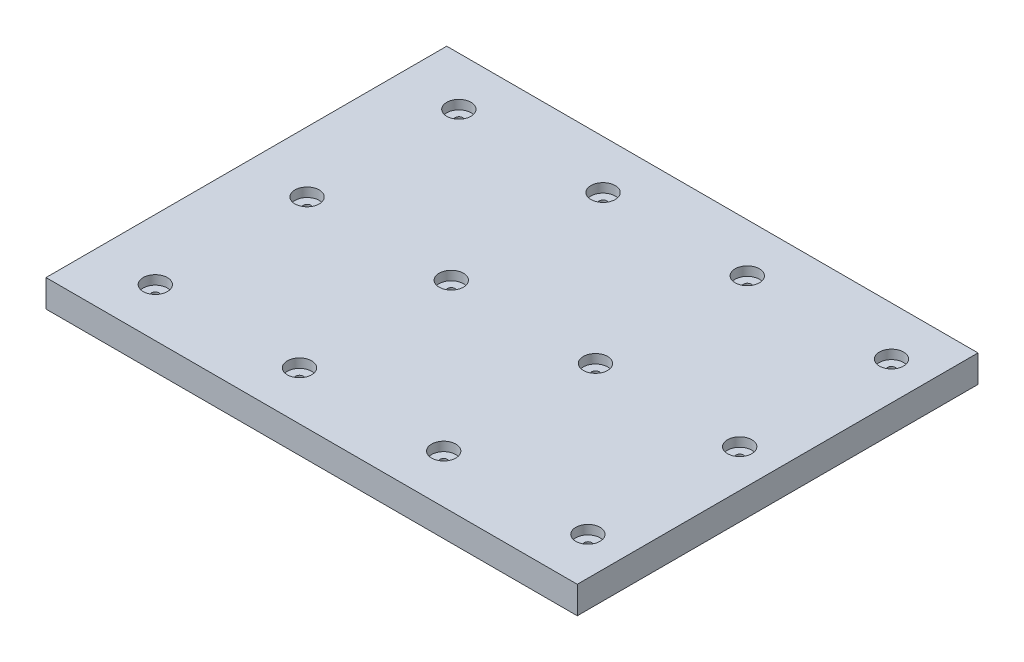
ISO-10303-21;
HEADER;
FILE_DESCRIPTION(('STEP AP214'),'2;1');
FILE_NAME('part.step','',(''),(''),'','','');
FILE_SCHEMA(('AUTOMOTIVE_DESIGN { 1 0 10303 214 1 1 1 1 }'));
ENDSEC;
DATA;
#1=APPLICATION_CONTEXT('core data for automotive mechanical design processes');
#2=APPLICATION_PROTOCOL_DEFINITION('international standard','automotive_design',2000,#1);
#3=PRODUCT_CONTEXT('',#1,'mechanical');
#4=PRODUCT('Part','Part','',(#3));
#5=PRODUCT_RELATED_PRODUCT_CATEGORY('part','',(#4));
#6=PRODUCT_DEFINITION_FORMATION('','',#4);
#7=PRODUCT_DEFINITION_CONTEXT('part definition',#1,'design');
#8=PRODUCT_DEFINITION('design','',#6,#7);
#9=PRODUCT_DEFINITION_SHAPE('','',#8);
#10=(LENGTH_UNIT() NAMED_UNIT(*) SI_UNIT(.MILLI.,.METRE.));
#11=(NAMED_UNIT(*) PLANE_ANGLE_UNIT() SI_UNIT($,.RADIAN.));
#12=(NAMED_UNIT(*) SI_UNIT($,.STERADIAN.) SOLID_ANGLE_UNIT());
#13=UNCERTAINTY_MEASURE_WITH_UNIT(LENGTH_MEASURE(1.E-05),#10,'distance_accuracy_value','');
#14=(GEOMETRIC_REPRESENTATION_CONTEXT(3) GLOBAL_UNCERTAINTY_ASSIGNED_CONTEXT((#13)) GLOBAL_UNIT_ASSIGNED_CONTEXT((#10,
#11,#12)) REPRESENTATION_CONTEXT('',''));
#15=CARTESIAN_POINT('',(0.,0.,0.));
#16=DIRECTION('',(0.,0.,1.));
#17=DIRECTION('',(1.,0.,0.));
#18=AXIS2_PLACEMENT_3D('',#15,#16,#17);
#19=CARTESIAN_POINT('',(40.,0.,-32.));
#20=DIRECTION('',(0.,1.,0.));
#21=DIRECTION('',(0.,0.,1.));
#22=AXIS2_PLACEMENT_3D('',#19,#20,#21);
#23=CYLINDRICAL_SURFACE('',#22,2.5);
#24=CARTESIAN_POINT('',(40.,0.,-32.));
#25=DIRECTION('',(0.,1.,0.));
#26=DIRECTION('',(0.,0.,1.));
#27=AXIS2_PLACEMENT_3D('',#24,#25,#26);
#28=CIRCLE('',#27,2.5);
#29=CARTESIAN_POINT('',(40.,0.,-29.5));
#30=VERTEX_POINT('',#29);
#31=EDGE_CURVE('E96',#30,#30,#28,.T.);
#32=ORIENTED_EDGE('',*,*,#31,.F.);
#33=EDGE_LOOP('',(#32));
#34=FACE_BOUND('',#33,.T.);
#35=CARTESIAN_POINT('',(40.,12.,-32.));
#36=DIRECTION('',(0.,1.,0.));
#37=DIRECTION('',(0.,0.,1.));
#38=AXIS2_PLACEMENT_3D('',#35,#36,#37);
#39=CIRCLE('',#38,2.5);
#40=CARTESIAN_POINT('',(40.,12.,-29.5));
#41=VERTEX_POINT('',#40);
#42=EDGE_CURVE('E139',#41,#41,#39,.F.);
#43=ORIENTED_EDGE('',*,*,#42,.F.);
#44=EDGE_LOOP('',(#43));
#45=FACE_BOUND('',#44,.T.);
#46=ADVANCED_FACE('F38',(#34,#45),#23,.F.);
#47=CARTESIAN_POINT('',(324.999999999999,0.,-232.));
#48=DIRECTION('',(0.,1.,0.));
#49=DIRECTION('',(0.,0.,1.));
#50=AXIS2_PLACEMENT_3D('',#47,#48,#49);
#51=CYLINDRICAL_SURFACE('',#50,2.50000000000002);
#52=CARTESIAN_POINT('',(324.999999999999,0.,-232.));
#53=DIRECTION('',(0.,1.,0.));
#54=DIRECTION('',(0.,0.,1.));
#55=AXIS2_PLACEMENT_3D('',#52,#53,#54);
#56=CIRCLE('',#55,2.50000000000002);
#57=CARTESIAN_POINT('',(324.999999999999,0.,-229.5));
#58=VERTEX_POINT('',#57);
#59=EDGE_CURVE('E150',#58,#58,#56,.T.);
#60=ORIENTED_EDGE('',*,*,#59,.F.);
#61=EDGE_LOOP('',(#60));
#62=FACE_BOUND('',#61,.T.);
#63=CARTESIAN_POINT('',(324.999999999999,12.,-232.));
#64=DIRECTION('',(0.,1.,0.));
#65=DIRECTION('',(0.,0.,1.));
#66=AXIS2_PLACEMENT_3D('',#63,#64,#65);
#67=CIRCLE('',#66,2.50000000000002);
#68=CARTESIAN_POINT('',(324.999999999999,12.,-229.5));
#69=VERTEX_POINT('',#68);
#70=EDGE_CURVE('E137',#69,#69,#67,.F.);
#71=ORIENTED_EDGE('',*,*,#70,.F.);
#72=EDGE_LOOP('',(#71));
#73=FACE_BOUND('',#72,.T.);
#74=ADVANCED_FACE('F281',(#62,#73),#51,.F.);
#75=CARTESIAN_POINT('',(229.999999999999,0.,-232.));
#76=DIRECTION('',(0.,1.,0.));
#77=DIRECTION('',(0.,0.,1.));
#78=AXIS2_PLACEMENT_3D('',#75,#76,#77);
#79=CYLINDRICAL_SURFACE('',#78,2.5);
#80=CARTESIAN_POINT('',(229.999999999999,0.,-232.));
#81=DIRECTION('',(0.,1.,0.));
#82=DIRECTION('',(0.,0.,1.));
#83=AXIS2_PLACEMENT_3D('',#80,#81,#82);
#84=CIRCLE('',#83,2.5);
#85=CARTESIAN_POINT('',(229.999999999999,0.,-229.5));
#86=VERTEX_POINT('',#85);
#87=EDGE_CURVE('E158',#86,#86,#84,.T.);
#88=ORIENTED_EDGE('',*,*,#87,.F.);
#89=EDGE_LOOP('',(#88));
#90=FACE_BOUND('',#89,.T.);
#91=CARTESIAN_POINT('',(229.999999999999,12.,-232.));
#92=DIRECTION('',(0.,1.,0.));
#93=DIRECTION('',(0.,0.,1.));
#94=AXIS2_PLACEMENT_3D('',#91,#92,#93);
#95=CIRCLE('',#94,2.5);
#96=CARTESIAN_POINT('',(229.999999999999,12.,-229.5));
#97=VERTEX_POINT('',#96);
#98=EDGE_CURVE('E134',#97,#97,#95,.F.);
#99=ORIENTED_EDGE('',*,*,#98,.F.);
#100=EDGE_LOOP('',(#99));
#101=FACE_BOUND('',#100,.T.);
#102=ADVANCED_FACE('F286',(#90,#101),#79,.F.);
#103=CARTESIAN_POINT('',(134.999999999999,0.,-232.));
#104=DIRECTION('',(0.,1.,0.));
#105=DIRECTION('',(0.,0.,1.));
#106=AXIS2_PLACEMENT_3D('',#103,#104,#105);
#107=CYLINDRICAL_SURFACE('',#106,2.50000000000002);
#108=CARTESIAN_POINT('',(134.999999999999,0.,-232.));
#109=DIRECTION('',(0.,1.,0.));
#110=DIRECTION('',(0.,0.,1.));
#111=AXIS2_PLACEMENT_3D('',#108,#109,#110);
#112=CIRCLE('',#111,2.50000000000002);
#113=CARTESIAN_POINT('',(134.999999999999,0.,-229.5));
#114=VERTEX_POINT('',#113);
#115=EDGE_CURVE('E159',#114,#114,#112,.T.);
#116=ORIENTED_EDGE('',*,*,#115,.F.);
#117=EDGE_LOOP('',(#116));
#118=FACE_BOUND('',#117,.T.);
#119=CARTESIAN_POINT('',(134.999999999999,12.,-232.));
#120=DIRECTION('',(0.,1.,0.));
#121=DIRECTION('',(0.,0.,1.));
#122=AXIS2_PLACEMENT_3D('',#119,#120,#121);
#123=CIRCLE('',#122,2.50000000000002);
#124=CARTESIAN_POINT('',(134.999999999999,12.,-229.5));
#125=VERTEX_POINT('',#124);
#126=EDGE_CURVE('E131',#125,#125,#123,.F.);
#127=ORIENTED_EDGE('',*,*,#126,.F.);
#128=EDGE_LOOP('',(#127));
#129=FACE_BOUND('',#128,.T.);
#130=ADVANCED_FACE('F319',(#118,#129),#107,.F.);
#131=CARTESIAN_POINT('',(39.9999999999993,0.,-232.));
#132=DIRECTION('',(0.,1.,0.));
#133=DIRECTION('',(0.,0.,1.));
#134=AXIS2_PLACEMENT_3D('',#131,#132,#133);
#135=CYLINDRICAL_SURFACE('',#134,2.5);
#136=CARTESIAN_POINT('',(39.9999999999993,0.,-232.));
#137=DIRECTION('',(0.,1.,0.));
#138=DIRECTION('',(0.,0.,1.));
#139=AXIS2_PLACEMENT_3D('',#136,#137,#138);
#140=CIRCLE('',#139,2.5);
#141=CARTESIAN_POINT('',(39.9999999999993,0.,-229.5));
#142=VERTEX_POINT('',#141);
#143=EDGE_CURVE('E141',#142,#142,#140,.T.);
#144=ORIENTED_EDGE('',*,*,#143,.F.);
#145=EDGE_LOOP('',(#144));
#146=FACE_BOUND('',#145,.T.);
#147=CARTESIAN_POINT('',(39.9999999999993,12.,-232.));
#148=DIRECTION('',(0.,1.,0.));
#149=DIRECTION('',(0.,0.,1.));
#150=AXIS2_PLACEMENT_3D('',#147,#148,#149);
#151=CIRCLE('',#150,2.5);
#152=CARTESIAN_POINT('',(39.9999999999993,12.,-229.5));
#153=VERTEX_POINT('',#152);
#154=EDGE_CURVE('E128',#153,#153,#151,.F.);
#155=ORIENTED_EDGE('',*,*,#154,.F.);
#156=EDGE_LOOP('',(#155));
#157=FACE_BOUND('',#156,.T.);
#158=ADVANCED_FACE('F322',(#146,#157),#135,.F.);
#159=CARTESIAN_POINT('',(39.9999999999997,0.,-132.));
#160=DIRECTION('',(0.,1.,0.));
#161=DIRECTION('',(0.,0.,1.));
#162=AXIS2_PLACEMENT_3D('',#159,#160,#161);
#163=CYLINDRICAL_SURFACE('',#162,2.5);
#164=CARTESIAN_POINT('',(39.9999999999997,0.,-132.));
#165=DIRECTION('',(0.,1.,0.));
#166=DIRECTION('',(0.,0.,1.));
#167=AXIS2_PLACEMENT_3D('',#164,#165,#166);
#168=CIRCLE('',#167,2.5);
#169=CARTESIAN_POINT('',(39.9999999999997,0.,-129.5));
#170=VERTEX_POINT('',#169);
#171=EDGE_CURVE('E145',#170,#170,#168,.T.);
#172=ORIENTED_EDGE('',*,*,#171,.F.);
#173=EDGE_LOOP('',(#172));
#174=FACE_BOUND('',#173,.T.);
#175=CARTESIAN_POINT('',(39.9999999999997,12.,-132.));
#176=DIRECTION('',(0.,1.,0.));
#177=DIRECTION('',(0.,0.,1.));
#178=AXIS2_PLACEMENT_3D('',#175,#176,#177);
#179=CIRCLE('',#178,2.5);
#180=CARTESIAN_POINT('',(39.9999999999997,12.,-129.5));
#181=VERTEX_POINT('',#180);
#182=EDGE_CURVE('E125',#181,#181,#179,.F.);
#183=ORIENTED_EDGE('',*,*,#182,.F.);
#184=EDGE_LOOP('',(#183));
#185=FACE_BOUND('',#184,.T.);
#186=ADVANCED_FACE('F304',(#174,#185),#163,.F.);
#187=CARTESIAN_POINT('',(135.,0.,-32.));
#188=DIRECTION('',(0.,1.,0.));
#189=DIRECTION('',(0.,0.,1.));
#190=AXIS2_PLACEMENT_3D('',#187,#188,#189);
#191=CYLINDRICAL_SURFACE('',#190,2.5);
#192=CARTESIAN_POINT('',(135.,0.,-32.));
#193=DIRECTION('',(0.,1.,0.));
#194=DIRECTION('',(0.,0.,1.));
#195=AXIS2_PLACEMENT_3D('',#192,#193,#194);
#196=CIRCLE('',#195,2.5);
#197=CARTESIAN_POINT('',(135.,0.,-29.5));
#198=VERTEX_POINT('',#197);
#199=EDGE_CURVE('E100',#198,#198,#196,.T.);
#200=ORIENTED_EDGE('',*,*,#199,.F.);
#201=EDGE_LOOP('',(#200));
#202=FACE_BOUND('',#201,.T.);
#203=CARTESIAN_POINT('',(135.,12.,-32.));
#204=DIRECTION('',(0.,1.,0.));
#205=DIRECTION('',(0.,0.,1.));
#206=AXIS2_PLACEMENT_3D('',#203,#204,#205);
#207=CIRCLE('',#206,2.5);
#208=CARTESIAN_POINT('',(135.,12.,-29.5));
#209=VERTEX_POINT('',#208);
#210=EDGE_CURVE('E122',#209,#209,#207,.F.);
#211=ORIENTED_EDGE('',*,*,#210,.F.);
#212=EDGE_LOOP('',(#211));
#213=FACE_BOUND('',#212,.T.);
#214=ADVANCED_FACE('F300',(#202,#213),#191,.F.);
#215=CARTESIAN_POINT('',(230.,0.,-32.));
#216=DIRECTION('',(0.,1.,0.));
#217=DIRECTION('',(0.,0.,1.));
#218=AXIS2_PLACEMENT_3D('',#215,#216,#217);
#219=CYLINDRICAL_SURFACE('',#218,2.5);
#220=CARTESIAN_POINT('',(230.,0.,-32.));
#221=DIRECTION('',(0.,1.,0.));
#222=DIRECTION('',(0.,0.,1.));
#223=AXIS2_PLACEMENT_3D('',#220,#221,#222);
#224=CIRCLE('',#223,2.5);
#225=CARTESIAN_POINT('',(230.,0.,-29.5));
#226=VERTEX_POINT('',#225);
#227=EDGE_CURVE('E176',#226,#226,#224,.T.);
#228=ORIENTED_EDGE('',*,*,#227,.F.);
#229=EDGE_LOOP('',(#228));
#230=FACE_BOUND('',#229,.T.);
#231=CARTESIAN_POINT('',(230.,12.,-32.));
#232=DIRECTION('',(0.,1.,0.));
#233=DIRECTION('',(0.,0.,1.));
#234=AXIS2_PLACEMENT_3D('',#231,#232,#233);
#235=CIRCLE('',#234,2.5);
#236=CARTESIAN_POINT('',(230.,12.,-29.5));
#237=VERTEX_POINT('',#236);
#238=EDGE_CURVE('E119',#237,#237,#235,.F.);
#239=ORIENTED_EDGE('',*,*,#238,.F.);
#240=EDGE_LOOP('',(#239));
#241=FACE_BOUND('',#240,.T.);
#242=ADVANCED_FACE('F296',(#230,#241),#219,.F.);
#243=CARTESIAN_POINT('',(325.,0.,-32.));
#244=DIRECTION('',(0.,1.,0.));
#245=DIRECTION('',(0.,0.,1.));
#246=AXIS2_PLACEMENT_3D('',#243,#244,#245);
#247=CYLINDRICAL_SURFACE('',#246,2.50000000000002);
#248=CARTESIAN_POINT('',(325.,0.,-32.));
#249=DIRECTION('',(0.,1.,0.));
#250=DIRECTION('',(0.,0.,1.));
#251=AXIS2_PLACEMENT_3D('',#248,#249,#250);
#252=CIRCLE('',#251,2.50000000000002);
#253=CARTESIAN_POINT('',(325.,0.,-29.5));
#254=VERTEX_POINT('',#253);
#255=EDGE_CURVE('E173',#254,#254,#252,.T.);
#256=ORIENTED_EDGE('',*,*,#255,.F.);
#257=EDGE_LOOP('',(#256));
#258=FACE_BOUND('',#257,.T.);
#259=CARTESIAN_POINT('',(325.,12.,-32.));
#260=DIRECTION('',(0.,1.,0.));
#261=DIRECTION('',(0.,0.,1.));
#262=AXIS2_PLACEMENT_3D('',#259,#260,#261);
#263=CIRCLE('',#262,2.50000000000002);
#264=CARTESIAN_POINT('',(325.,12.,-29.5));
#265=VERTEX_POINT('',#264);
#266=EDGE_CURVE('E116',#265,#265,#263,.F.);
#267=ORIENTED_EDGE('',*,*,#266,.F.);
#268=EDGE_LOOP('',(#267));
#269=FACE_BOUND('',#268,.T.);
#270=ADVANCED_FACE('F292',(#258,#269),#247,.F.);
#271=CARTESIAN_POINT('',(135.,0.,-132.));
#272=DIRECTION('',(0.,1.,0.));
#273=DIRECTION('',(0.,0.,1.));
#274=AXIS2_PLACEMENT_3D('',#271,#272,#273);
#275=CYLINDRICAL_SURFACE('',#274,2.50000000000002);
#276=CARTESIAN_POINT('',(135.,0.,-132.));
#277=DIRECTION('',(0.,1.,0.));
#278=DIRECTION('',(0.,0.,1.));
#279=AXIS2_PLACEMENT_3D('',#276,#277,#278);
#280=CIRCLE('',#279,2.50000000000002);
#281=CARTESIAN_POINT('',(135.,0.,-129.5));
#282=VERTEX_POINT('',#281);
#283=EDGE_CURVE('E168',#282,#282,#280,.T.);
#284=ORIENTED_EDGE('',*,*,#283,.F.);
#285=EDGE_LOOP('',(#284));
#286=FACE_BOUND('',#285,.T.);
#287=CARTESIAN_POINT('',(135.,12.,-132.));
#288=DIRECTION('',(0.,1.,0.));
#289=DIRECTION('',(0.,0.,1.));
#290=AXIS2_PLACEMENT_3D('',#287,#288,#289);
#291=CIRCLE('',#290,2.50000000000002);
#292=CARTESIAN_POINT('',(135.,12.,-129.5));
#293=VERTEX_POINT('',#292);
#294=EDGE_CURVE('E113',#293,#293,#291,.F.);
#295=ORIENTED_EDGE('',*,*,#294,.F.);
#296=EDGE_LOOP('',(#295));
#297=FACE_BOUND('',#296,.T.);
#298=ADVANCED_FACE('F295',(#286,#297),#275,.F.);
#299=CARTESIAN_POINT('',(230.,0.,-132.));
#300=DIRECTION('',(0.,1.,0.));
#301=DIRECTION('',(0.,0.,1.));
#302=AXIS2_PLACEMENT_3D('',#299,#300,#301);
#303=CYLINDRICAL_SURFACE('',#302,2.5);
#304=CARTESIAN_POINT('',(230.,0.,-132.));
#305=DIRECTION('',(0.,1.,0.));
#306=DIRECTION('',(0.,0.,1.));
#307=AXIS2_PLACEMENT_3D('',#304,#305,#306);
#308=CIRCLE('',#307,2.5);
#309=CARTESIAN_POINT('',(230.,0.,-129.5));
#310=VERTEX_POINT('',#309);
#311=EDGE_CURVE('E165',#310,#310,#308,.T.);
#312=ORIENTED_EDGE('',*,*,#311,.F.);
#313=EDGE_LOOP('',(#312));
#314=FACE_BOUND('',#313,.T.);
#315=CARTESIAN_POINT('',(230.,12.,-132.));
#316=DIRECTION('',(0.,1.,0.));
#317=DIRECTION('',(0.,0.,1.));
#318=AXIS2_PLACEMENT_3D('',#315,#316,#317);
#319=CIRCLE('',#318,2.5);
#320=CARTESIAN_POINT('',(230.,12.,-129.5));
#321=VERTEX_POINT('',#320);
#322=EDGE_CURVE('E109',#321,#321,#319,.F.);
#323=ORIENTED_EDGE('',*,*,#322,.F.);
#324=EDGE_LOOP('',(#323));
#325=FACE_BOUND('',#324,.T.);
#326=ADVANCED_FACE('F308',(#314,#325),#303,.F.);
#327=CARTESIAN_POINT('',(325.,0.,-132.));
#328=DIRECTION('',(0.,1.,0.));
#329=DIRECTION('',(0.,0.,1.));
#330=AXIS2_PLACEMENT_3D('',#327,#328,#329);
#331=CYLINDRICAL_SURFACE('',#330,2.50000000000002);
#332=CARTESIAN_POINT('',(325.,0.,-132.));
#333=DIRECTION('',(0.,1.,0.));
#334=DIRECTION('',(0.,0.,1.));
#335=AXIS2_PLACEMENT_3D('',#332,#333,#334);
#336=CIRCLE('',#335,2.50000000000002);
#337=CARTESIAN_POINT('',(325.,0.,-129.5));
#338=VERTEX_POINT('',#337);
#339=EDGE_CURVE('E162',#338,#338,#336,.T.);
#340=ORIENTED_EDGE('',*,*,#339,.F.);
#341=EDGE_LOOP('',(#340));
#342=FACE_BOUND('',#341,.T.);
#343=CARTESIAN_POINT('',(325.,12.,-132.));
#344=DIRECTION('',(0.,1.,0.));
#345=DIRECTION('',(0.,0.,1.));
#346=AXIS2_PLACEMENT_3D('',#343,#344,#345);
#347=CIRCLE('',#346,2.50000000000002);
#348=CARTESIAN_POINT('',(325.,12.,-129.5));
#349=VERTEX_POINT('',#348);
#350=EDGE_CURVE('E106',#349,#349,#347,.F.);
#351=ORIENTED_EDGE('',*,*,#350,.F.);
#352=EDGE_LOOP('',(#351));
#353=FACE_BOUND('',#352,.T.);
#354=ADVANCED_FACE('F310',(#342,#353),#331,.F.);
#355=CARTESIAN_POINT('',(0.,18.,0.));
#356=DIRECTION('',(1.,0.,0.));
#357=DIRECTION('',(0.,0.,-1.));
#358=AXIS2_PLACEMENT_3D('',#355,#356,#357);
#359=PLANE('',#358);
#360=DIRECTION('',(0.,0.,1.));
#361=VECTOR('',#360,1.);
#362=CARTESIAN_POINT('',(0.,0.,0.));
#363=LINE('',#362,#361);
#364=CARTESIAN_POINT('',(0.,0.,-264.));
#365=VERTEX_POINT('',#364);
#366=CARTESIAN_POINT('',(0.,0.,0.));
#367=VERTEX_POINT('',#366);
#368=EDGE_CURVE('E90',#365,#367,#363,.T.);
#369=ORIENTED_EDGE('',*,*,#368,.T.);
#370=DIRECTION('',(0.,-1.,0.));
#371=VECTOR('',#370,1.);
#372=CARTESIAN_POINT('',(0.,18.,0.));
#373=LINE('',#372,#371);
#374=CARTESIAN_POINT('',(0.,18.,0.));
#375=VERTEX_POINT('',#374);
#376=EDGE_CURVE('E46',#375,#367,#373,.T.);
#377=ORIENTED_EDGE('',*,*,#376,.F.);
#378=DIRECTION('',(0.,0.,1.));
#379=VECTOR('',#378,1.);
#380=CARTESIAN_POINT('',(0.,18.,0.));
#381=LINE('',#380,#379);
#382=CARTESIAN_POINT('',(0.,18.,-264.));
#383=VERTEX_POINT('',#382);
#384=EDGE_CURVE('E84',#383,#375,#381,.T.);
#385=ORIENTED_EDGE('',*,*,#384,.F.);
#386=DIRECTION('',(0.,-1.,0.));
#387=VECTOR('',#386,1.);
#388=CARTESIAN_POINT('',(0.,18.,-264.));
#389=LINE('',#388,#387);
#390=EDGE_CURVE('E78',#383,#365,#389,.T.);
#391=ORIENTED_EDGE('',*,*,#390,.T.);
#392=EDGE_LOOP('',(#369,#377,#385,#391));
#393=FACE_BOUND('',#392,.T.);
#394=ADVANCED_FACE('F40',(#393),#359,.F.);
#395=CARTESIAN_POINT('',(0.,18.,0.));
#396=DIRECTION('',(0.,0.,-1.));
#397=DIRECTION('',(-1.,0.,0.));
#398=AXIS2_PLACEMENT_3D('',#395,#396,#397);
#399=PLANE('',#398);
#400=DIRECTION('',(1.,0.,0.));
#401=VECTOR('',#400,1.);
#402=CARTESIAN_POINT('',(0.,0.,0.));
#403=LINE('',#402,#401);
#404=CARTESIAN_POINT('',(350.,0.,0.));
#405=VERTEX_POINT('',#404);
#406=EDGE_CURVE('E85',#367,#405,#403,.T.);
#407=ORIENTED_EDGE('',*,*,#406,.T.);
#408=DIRECTION('',(0.,1.,0.));
#409=VECTOR('',#408,1.);
#410=CARTESIAN_POINT('',(350.,-2.,0.));
#411=LINE('',#410,#409);
#412=CARTESIAN_POINT('',(350.,18.,0.));
#413=VERTEX_POINT('',#412);
#414=EDGE_CURVE('E52',#405,#413,#411,.T.);
#415=ORIENTED_EDGE('',*,*,#414,.T.);
#416=DIRECTION('',(1.,0.,0.));
#417=VECTOR('',#416,1.);
#418=CARTESIAN_POINT('',(0.,18.,0.));
#419=LINE('',#418,#417);
#420=EDGE_CURVE('E181',#375,#413,#419,.T.);
#421=ORIENTED_EDGE('',*,*,#420,.F.);
#422=ORIENTED_EDGE('',*,*,#376,.T.);
#423=EDGE_LOOP('',(#407,#415,#421,#422));
#424=FACE_BOUND('',#423,.T.);
#425=ADVANCED_FACE('F189',(#424),#399,.F.);
#426=CARTESIAN_POINT('',(0.,18.,-264.));
#427=DIRECTION('',(0.,0.,1.));
#428=DIRECTION('',(1.,0.,0.));
#429=AXIS2_PLACEMENT_3D('',#426,#427,#428);
#430=PLANE('',#429);
#431=DIRECTION('',(-1.,0.,0.));
#432=VECTOR('',#431,1.);
#433=CARTESIAN_POINT('',(0.,18.,-264.));
#434=LINE('',#433,#432);
#435=CARTESIAN_POINT('',(350.,18.,-264.));
#436=VERTEX_POINT('',#435);
#437=EDGE_CURVE('E61',#436,#383,#434,.T.);
#438=ORIENTED_EDGE('',*,*,#437,.F.);
#439=DIRECTION('',(0.,1.,0.));
#440=VECTOR('',#439,1.);
#441=CARTESIAN_POINT('',(350.,-2.,-264.));
#442=LINE('',#441,#440);
#443=CARTESIAN_POINT('',(350.,0.,-264.));
#444=VERTEX_POINT('',#443);
#445=EDGE_CURVE('E81',#444,#436,#442,.T.);
#446=ORIENTED_EDGE('',*,*,#445,.F.);
#447=DIRECTION('',(-1.,0.,0.));
#448=VECTOR('',#447,1.);
#449=CARTESIAN_POINT('',(0.,0.,-264.));
#450=LINE('',#449,#448);
#451=EDGE_CURVE('E75',#444,#365,#450,.T.);
#452=ORIENTED_EDGE('',*,*,#451,.T.);
#453=ORIENTED_EDGE('',*,*,#390,.F.);
#454=EDGE_LOOP('',(#438,#446,#452,#453));
#455=FACE_BOUND('',#454,.T.);
#456=ADVANCED_FACE('F77',(#455),#430,.F.);
#457=CARTESIAN_POINT('',(0.,18.,0.));
#458=DIRECTION('',(0.,-1.,0.));
#459=DIRECTION('',(0.,0.,-1.));
#460=AXIS2_PLACEMENT_3D('',#457,#458,#459);
#461=PLANE('',#460);
#462=CARTESIAN_POINT('',(325.,18.,-132.));
#463=DIRECTION('',(0.,1.,0.));
#464=DIRECTION('',(0.,0.,1.));
#465=AXIS2_PLACEMENT_3D('',#462,#463,#464);
#466=CIRCLE('',#465,7.99999999999999);
#467=CARTESIAN_POINT('',(325.,18.,-124.));
#468=VERTEX_POINT('',#467);
#469=EDGE_CURVE('E216',#468,#468,#466,.T.);
#470=ORIENTED_EDGE('',*,*,#469,.F.);
#471=EDGE_LOOP('',(#470));
#472=FACE_BOUND('',#471,.T.);
#473=CARTESIAN_POINT('',(230.,18.,-132.));
#474=DIRECTION('',(0.,1.,0.));
#475=DIRECTION('',(0.,0.,1.));
#476=AXIS2_PLACEMENT_3D('',#473,#474,#475);
#477=CIRCLE('',#476,7.99999999999999);
#478=CARTESIAN_POINT('',(230.,18.,-124.));
#479=VERTEX_POINT('',#478);
#480=EDGE_CURVE('E229',#479,#479,#477,.T.);
#481=ORIENTED_EDGE('',*,*,#480,.F.);
#482=EDGE_LOOP('',(#481));
#483=FACE_BOUND('',#482,.T.);
#484=CARTESIAN_POINT('',(135.,18.,-132.));
#485=DIRECTION('',(0.,1.,0.));
#486=DIRECTION('',(0.,0.,1.));
#487=AXIS2_PLACEMENT_3D('',#484,#485,#486);
#488=CIRCLE('',#487,8.00000000000001);
#489=CARTESIAN_POINT('',(135.,18.,-124.));
#490=VERTEX_POINT('',#489);
#491=EDGE_CURVE('E228',#490,#490,#488,.T.);
#492=ORIENTED_EDGE('',*,*,#491,.F.);
#493=EDGE_LOOP('',(#492));
#494=FACE_BOUND('',#493,.T.);
#495=CARTESIAN_POINT('',(325.,18.,-32.));
#496=DIRECTION('',(0.,1.,0.));
#497=DIRECTION('',(0.,0.,1.));
#498=AXIS2_PLACEMENT_3D('',#495,#496,#497);
#499=CIRCLE('',#498,7.99999999999998);
#500=CARTESIAN_POINT('',(325.,18.,-24.));
#501=VERTEX_POINT('',#500);
#502=EDGE_CURVE('E240',#501,#501,#499,.T.);
#503=ORIENTED_EDGE('',*,*,#502,.F.);
#504=EDGE_LOOP('',(#503));
#505=FACE_BOUND('',#504,.T.);
#506=CARTESIAN_POINT('',(230.,18.,-32.));
#507=DIRECTION('',(0.,1.,0.));
#508=DIRECTION('',(0.,0.,1.));
#509=AXIS2_PLACEMENT_3D('',#506,#507,#508);
#510=CIRCLE('',#509,7.99999999999998);
#511=CARTESIAN_POINT('',(230.,18.,-24.));
#512=VERTEX_POINT('',#511);
#513=EDGE_CURVE('E252',#512,#512,#510,.T.);
#514=ORIENTED_EDGE('',*,*,#513,.F.);
#515=EDGE_LOOP('',(#514));
#516=FACE_BOUND('',#515,.T.);
#517=CARTESIAN_POINT('',(135.,18.,-32.));
#518=DIRECTION('',(0.,1.,0.));
#519=DIRECTION('',(0.,0.,1.));
#520=AXIS2_PLACEMENT_3D('',#517,#518,#519);
#521=CIRCLE('',#520,7.99999999999998);
#522=CARTESIAN_POINT('',(135.,18.,-24.));
#523=VERTEX_POINT('',#522);
#524=EDGE_CURVE('E246',#523,#523,#521,.T.);
#525=ORIENTED_EDGE('',*,*,#524,.F.);
#526=EDGE_LOOP('',(#525));
#527=FACE_BOUND('',#526,.T.);
#528=CARTESIAN_POINT('',(39.9999999999997,18.,-132.));
#529=DIRECTION('',(0.,1.,0.));
#530=DIRECTION('',(0.,0.,1.));
#531=AXIS2_PLACEMENT_3D('',#528,#529,#530);
#532=CIRCLE('',#531,8.);
#533=CARTESIAN_POINT('',(39.9999999999997,18.,-124.));
#534=VERTEX_POINT('',#533);
#535=EDGE_CURVE('E199',#534,#534,#532,.T.);
#536=ORIENTED_EDGE('',*,*,#535,.F.);
#537=EDGE_LOOP('',(#536));
#538=FACE_BOUND('',#537,.T.);
#539=CARTESIAN_POINT('',(39.9999999999993,18.,-232.));
#540=DIRECTION('',(0.,1.,0.));
#541=DIRECTION('',(0.,0.,1.));
#542=AXIS2_PLACEMENT_3D('',#539,#540,#541);
#543=CIRCLE('',#542,8.);
#544=CARTESIAN_POINT('',(39.9999999999993,18.,-224.));
#545=VERTEX_POINT('',#544);
#546=EDGE_CURVE('E190',#545,#545,#543,.T.);
#547=ORIENTED_EDGE('',*,*,#546,.F.);
#548=EDGE_LOOP('',(#547));
#549=FACE_BOUND('',#548,.T.);
#550=CARTESIAN_POINT('',(134.999999999999,18.,-232.));
#551=DIRECTION('',(0.,1.,0.));
#552=DIRECTION('',(0.,0.,1.));
#553=AXIS2_PLACEMENT_3D('',#550,#551,#552);
#554=CIRCLE('',#553,8.00000000000001);
#555=CARTESIAN_POINT('',(134.999999999999,18.,-224.));
#556=VERTEX_POINT('',#555);
#557=EDGE_CURVE('E217',#556,#556,#554,.T.);
#558=ORIENTED_EDGE('',*,*,#557,.F.);
#559=EDGE_LOOP('',(#558));
#560=FACE_BOUND('',#559,.T.);
#561=CARTESIAN_POINT('',(229.999999999999,18.,-232.));
#562=DIRECTION('',(0.,1.,0.));
#563=DIRECTION('',(0.,0.,1.));
#564=AXIS2_PLACEMENT_3D('',#561,#562,#563);
#565=CIRCLE('',#564,7.99999999999999);
#566=CARTESIAN_POINT('',(229.999999999999,18.,-224.));
#567=VERTEX_POINT('',#566);
#568=EDGE_CURVE('E210',#567,#567,#565,.T.);
#569=ORIENTED_EDGE('',*,*,#568,.F.);
#570=EDGE_LOOP('',(#569));
#571=FACE_BOUND('',#570,.T.);
#572=CARTESIAN_POINT('',(324.999999999999,18.,-232.));
#573=DIRECTION('',(0.,1.,0.));
#574=DIRECTION('',(0.,0.,1.));
#575=AXIS2_PLACEMENT_3D('',#572,#573,#574);
#576=CIRCLE('',#575,7.99999999999999);
#577=CARTESIAN_POINT('',(324.999999999999,18.,-224.));
#578=VERTEX_POINT('',#577);
#579=EDGE_CURVE('E204',#578,#578,#576,.T.);
#580=ORIENTED_EDGE('',*,*,#579,.F.);
#581=EDGE_LOOP('',(#580));
#582=FACE_BOUND('',#581,.T.);
#583=CARTESIAN_POINT('',(40.,18.,-32.));
#584=DIRECTION('',(0.,1.,0.));
#585=DIRECTION('',(0.,0.,1.));
#586=AXIS2_PLACEMENT_3D('',#583,#584,#585);
#587=CIRCLE('',#586,8.);
#588=CARTESIAN_POINT('',(40.,18.,-24.));
#589=VERTEX_POINT('',#588);
#590=EDGE_CURVE('E153',#589,#589,#587,.T.);
#591=ORIENTED_EDGE('',*,*,#590,.F.);
#592=EDGE_LOOP('',(#591));
#593=FACE_BOUND('',#592,.T.);
#594=ORIENTED_EDGE('',*,*,#420,.T.);
#595=DIRECTION('',(0.,0.,1.));
#596=VECTOR('',#595,1.);
#597=CARTESIAN_POINT('',(350.,18.,-264.));
#598=LINE('',#597,#596);
#599=EDGE_CURVE('E186',#436,#413,#598,.T.);
#600=ORIENTED_EDGE('',*,*,#599,.F.);
#601=ORIENTED_EDGE('',*,*,#437,.T.);
#602=ORIENTED_EDGE('',*,*,#384,.T.);
#603=EDGE_LOOP('',(#594,#600,#601,#602));
#604=FACE_BOUND('',#603,.T.);
#605=ADVANCED_FACE('F184',(#472,#483,#494,#505,#516,#527,#538,#549,#560,#571,#582,#593,#604),
#461,.F.);
#606=CARTESIAN_POINT('',(0.,0.,0.));
#607=DIRECTION('',(0.,-1.,0.));
#608=DIRECTION('',(0.,0.,-1.));
#609=AXIS2_PLACEMENT_3D('',#606,#607,#608);
#610=PLANE('',#609);
#611=DIRECTION('',(0.,0.,-1.));
#612=VECTOR('',#611,1.);
#613=CARTESIAN_POINT('',(350.,0.,0.));
#614=LINE('',#613,#612);
#615=EDGE_CURVE('E11',#405,#444,#614,.T.);
#616=ORIENTED_EDGE('',*,*,#615,.F.);
#617=ORIENTED_EDGE('',*,*,#406,.F.);
#618=ORIENTED_EDGE('',*,*,#368,.F.);
#619=ORIENTED_EDGE('',*,*,#451,.F.);
#620=EDGE_LOOP('',(#616,#617,#618,#619));
#621=FACE_BOUND('',#620,.T.);
#622=ORIENTED_EDGE('',*,*,#339,.T.);
#623=EDGE_LOOP('',(#622));
#624=FACE_BOUND('',#623,.T.);
#625=ORIENTED_EDGE('',*,*,#311,.T.);
#626=EDGE_LOOP('',(#625));
#627=FACE_BOUND('',#626,.T.);
#628=ORIENTED_EDGE('',*,*,#283,.T.);
#629=EDGE_LOOP('',(#628));
#630=FACE_BOUND('',#629,.T.);
#631=ORIENTED_EDGE('',*,*,#255,.T.);
#632=EDGE_LOOP('',(#631));
#633=FACE_BOUND('',#632,.T.);
#634=ORIENTED_EDGE('',*,*,#227,.T.);
#635=EDGE_LOOP('',(#634));
#636=FACE_BOUND('',#635,.T.);
#637=ORIENTED_EDGE('',*,*,#199,.T.);
#638=EDGE_LOOP('',(#637));
#639=FACE_BOUND('',#638,.T.);
#640=ORIENTED_EDGE('',*,*,#171,.T.);
#641=EDGE_LOOP('',(#640));
#642=FACE_BOUND('',#641,.T.);
#643=ORIENTED_EDGE('',*,*,#143,.T.);
#644=EDGE_LOOP('',(#643));
#645=FACE_BOUND('',#644,.T.);
#646=ORIENTED_EDGE('',*,*,#115,.T.);
#647=EDGE_LOOP('',(#646));
#648=FACE_BOUND('',#647,.T.);
#649=ORIENTED_EDGE('',*,*,#87,.T.);
#650=EDGE_LOOP('',(#649));
#651=FACE_BOUND('',#650,.T.);
#652=ORIENTED_EDGE('',*,*,#59,.T.);
#653=EDGE_LOOP('',(#652));
#654=FACE_BOUND('',#653,.T.);
#655=ORIENTED_EDGE('',*,*,#31,.T.);
#656=EDGE_LOOP('',(#655));
#657=FACE_BOUND('',#656,.T.);
#658=ADVANCED_FACE('F92',(#621,#624,#627,#630,#633,#636,#639,#642,#645,#648,#651,#654,#657),
#610,.T.);
#659=CARTESIAN_POINT('',(325.,12.,-132.));
#660=DIRECTION('',(0.,1.,0.));
#661=DIRECTION('',(0.,0.,1.));
#662=AXIS2_PLACEMENT_3D('',#659,#660,#661);
#663=PLANE('',#662);
#664=CARTESIAN_POINT('',(325.,12.,-132.));
#665=DIRECTION('',(0.,1.,0.));
#666=DIRECTION('',(0.,0.,1.));
#667=AXIS2_PLACEMENT_3D('',#664,#665,#666);
#668=CIRCLE('',#667,7.99999999999999);
#669=CARTESIAN_POINT('',(325.,12.,-124.));
#670=VERTEX_POINT('',#669);
#671=EDGE_CURVE('E232',#670,#670,#668,.T.);
#672=ORIENTED_EDGE('',*,*,#671,.T.);
#673=EDGE_LOOP('',(#672));
#674=FACE_BOUND('',#673,.T.);
#675=ORIENTED_EDGE('',*,*,#350,.T.);
#676=EDGE_LOOP('',(#675));
#677=FACE_BOUND('',#676,.T.);
#678=ADVANCED_FACE('F274',(#674,#677),#663,.T.);
#679=CARTESIAN_POINT('',(325.,12.,-132.));
#680=DIRECTION('',(0.,1.,0.));
#681=DIRECTION('',(0.,0.,1.));
#682=AXIS2_PLACEMENT_3D('',#679,#680,#681);
#683=CYLINDRICAL_SURFACE('',#682,7.99999999999999);
#684=ORIENTED_EDGE('',*,*,#671,.F.);
#685=EDGE_LOOP('',(#684));
#686=FACE_BOUND('',#685,.T.);
#687=ORIENTED_EDGE('',*,*,#469,.T.);
#688=EDGE_LOOP('',(#687));
#689=FACE_BOUND('',#688,.T.);
#690=ADVANCED_FACE('F373',(#686,#689),#683,.F.);
#691=CARTESIAN_POINT('',(230.,12.,-132.));
#692=DIRECTION('',(0.,1.,0.));
#693=DIRECTION('',(0.,0.,1.));
#694=AXIS2_PLACEMENT_3D('',#691,#692,#693);
#695=PLANE('',#694);
#696=CARTESIAN_POINT('',(230.,12.,-132.));
#697=DIRECTION('',(0.,1.,0.));
#698=DIRECTION('',(0.,0.,1.));
#699=AXIS2_PLACEMENT_3D('',#696,#697,#698);
#700=CIRCLE('',#699,7.99999999999999);
#701=CARTESIAN_POINT('',(230.,12.,-124.));
#702=VERTEX_POINT('',#701);
#703=EDGE_CURVE('E225',#702,#702,#700,.T.);
#704=ORIENTED_EDGE('',*,*,#703,.T.);
#705=EDGE_LOOP('',(#704));
#706=FACE_BOUND('',#705,.T.);
#707=ORIENTED_EDGE('',*,*,#322,.T.);
#708=EDGE_LOOP('',(#707));
#709=FACE_BOUND('',#708,.T.);
#710=ADVANCED_FACE('F376',(#706,#709),#695,.T.);
#711=CARTESIAN_POINT('',(230.,12.,-132.));
#712=DIRECTION('',(0.,1.,0.));
#713=DIRECTION('',(0.,0.,1.));
#714=AXIS2_PLACEMENT_3D('',#711,#712,#713);
#715=CYLINDRICAL_SURFACE('',#714,7.99999999999999);
#716=ORIENTED_EDGE('',*,*,#703,.F.);
#717=EDGE_LOOP('',(#716));
#718=FACE_BOUND('',#717,.T.);
#719=ORIENTED_EDGE('',*,*,#480,.T.);
#720=EDGE_LOOP('',(#719));
#721=FACE_BOUND('',#720,.T.);
#722=ADVANCED_FACE('F371',(#718,#721),#715,.F.);
#723=CARTESIAN_POINT('',(135.,12.,-132.));
#724=DIRECTION('',(0.,1.,0.));
#725=DIRECTION('',(0.,0.,1.));
#726=AXIS2_PLACEMENT_3D('',#723,#724,#725);
#727=PLANE('',#726);
#728=CARTESIAN_POINT('',(135.,12.,-132.));
#729=DIRECTION('',(0.,1.,0.));
#730=DIRECTION('',(0.,0.,1.));
#731=AXIS2_PLACEMENT_3D('',#728,#729,#730);
#732=CIRCLE('',#731,8.00000000000001);
#733=CARTESIAN_POINT('',(135.,12.,-124.));
#734=VERTEX_POINT('',#733);
#735=EDGE_CURVE('E237',#734,#734,#732,.T.);
#736=ORIENTED_EDGE('',*,*,#735,.T.);
#737=EDGE_LOOP('',(#736));
#738=FACE_BOUND('',#737,.T.);
#739=ORIENTED_EDGE('',*,*,#294,.T.);
#740=EDGE_LOOP('',(#739));
#741=FACE_BOUND('',#740,.T.);
#742=ADVANCED_FACE('F367',(#738,#741),#727,.T.);
#743=CARTESIAN_POINT('',(135.,12.,-132.));
#744=DIRECTION('',(0.,1.,0.));
#745=DIRECTION('',(0.,0.,1.));
#746=AXIS2_PLACEMENT_3D('',#743,#744,#745);
#747=CYLINDRICAL_SURFACE('',#746,8.00000000000001);
#748=ORIENTED_EDGE('',*,*,#735,.F.);
#749=EDGE_LOOP('',(#748));
#750=FACE_BOUND('',#749,.T.);
#751=ORIENTED_EDGE('',*,*,#491,.T.);
#752=EDGE_LOOP('',(#751));
#753=FACE_BOUND('',#752,.T.);
#754=ADVANCED_FACE('F347',(#750,#753),#747,.F.);
#755=CARTESIAN_POINT('',(325.,12.,-32.));
#756=DIRECTION('',(0.,1.,0.));
#757=DIRECTION('',(0.,0.,1.));
#758=AXIS2_PLACEMENT_3D('',#755,#756,#757);
#759=PLANE('',#758);
#760=CARTESIAN_POINT('',(325.,12.,-32.));
#761=DIRECTION('',(0.,1.,0.));
#762=DIRECTION('',(0.,0.,1.));
#763=AXIS2_PLACEMENT_3D('',#760,#761,#762);
#764=CIRCLE('',#763,7.99999999999998);
#765=CARTESIAN_POINT('',(325.,12.,-24.));
#766=VERTEX_POINT('',#765);
#767=EDGE_CURVE('E255',#766,#766,#764,.T.);
#768=ORIENTED_EDGE('',*,*,#767,.T.);
#769=EDGE_LOOP('',(#768));
#770=FACE_BOUND('',#769,.T.);
#771=ORIENTED_EDGE('',*,*,#266,.T.);
#772=EDGE_LOOP('',(#771));
#773=FACE_BOUND('',#772,.T.);
#774=ADVANCED_FACE('F343',(#770,#773),#759,.T.);
#775=CARTESIAN_POINT('',(325.,12.,-32.));
#776=DIRECTION('',(0.,1.,0.));
#777=DIRECTION('',(0.,0.,1.));
#778=AXIS2_PLACEMENT_3D('',#775,#776,#777);
#779=CYLINDRICAL_SURFACE('',#778,7.99999999999998);
#780=ORIENTED_EDGE('',*,*,#767,.F.);
#781=EDGE_LOOP('',(#780));
#782=FACE_BOUND('',#781,.T.);
#783=ORIENTED_EDGE('',*,*,#502,.T.);
#784=EDGE_LOOP('',(#783));
#785=FACE_BOUND('',#784,.T.);
#786=ADVANCED_FACE('F339',(#782,#785),#779,.F.);
#787=CARTESIAN_POINT('',(230.,12.,-32.));
#788=DIRECTION('',(0.,1.,0.));
#789=DIRECTION('',(0.,0.,1.));
#790=AXIS2_PLACEMENT_3D('',#787,#788,#789);
#791=PLANE('',#790);
#792=CARTESIAN_POINT('',(230.,12.,-32.));
#793=DIRECTION('',(0.,1.,0.));
#794=DIRECTION('',(0.,0.,1.));
#795=AXIS2_PLACEMENT_3D('',#792,#793,#794);
#796=CIRCLE('',#795,7.99999999999998);
#797=CARTESIAN_POINT('',(230.,12.,-24.));
#798=VERTEX_POINT('',#797);
#799=EDGE_CURVE('E249',#798,#798,#796,.T.);
#800=ORIENTED_EDGE('',*,*,#799,.T.);
#801=EDGE_LOOP('',(#800));
#802=FACE_BOUND('',#801,.T.);
#803=ORIENTED_EDGE('',*,*,#238,.T.);
#804=EDGE_LOOP('',(#803));
#805=FACE_BOUND('',#804,.T.);
#806=ADVANCED_FACE('F342',(#802,#805),#791,.T.);
#807=CARTESIAN_POINT('',(230.,12.,-32.));
#808=DIRECTION('',(0.,1.,0.));
#809=DIRECTION('',(0.,0.,1.));
#810=AXIS2_PLACEMENT_3D('',#807,#808,#809);
#811=CYLINDRICAL_SURFACE('',#810,7.99999999999998);
#812=ORIENTED_EDGE('',*,*,#799,.F.);
#813=EDGE_LOOP('',(#812));
#814=FACE_BOUND('',#813,.T.);
#815=ORIENTED_EDGE('',*,*,#513,.T.);
#816=EDGE_LOOP('',(#815));
#817=FACE_BOUND('',#816,.T.);
#818=ADVANCED_FACE('F349',(#814,#817),#811,.F.);
#819=CARTESIAN_POINT('',(135.,12.,-32.));
#820=DIRECTION('',(0.,1.,0.));
#821=DIRECTION('',(0.,0.,1.));
#822=AXIS2_PLACEMENT_3D('',#819,#820,#821);
#823=PLANE('',#822);
#824=CARTESIAN_POINT('',(135.,12.,-32.));
#825=DIRECTION('',(0.,1.,0.));
#826=DIRECTION('',(0.,0.,1.));
#827=AXIS2_PLACEMENT_3D('',#824,#825,#826);
#828=CIRCLE('',#827,7.99999999999998);
#829=CARTESIAN_POINT('',(135.,12.,-24.));
#830=VERTEX_POINT('',#829);
#831=EDGE_CURVE('E243',#830,#830,#828,.T.);
#832=ORIENTED_EDGE('',*,*,#831,.T.);
#833=EDGE_LOOP('',(#832));
#834=FACE_BOUND('',#833,.T.);
#835=ORIENTED_EDGE('',*,*,#210,.T.);
#836=EDGE_LOOP('',(#835));
#837=FACE_BOUND('',#836,.T.);
#838=ADVANCED_FACE('F352',(#834,#837),#823,.T.);
#839=CARTESIAN_POINT('',(135.,12.,-32.));
#840=DIRECTION('',(0.,1.,0.));
#841=DIRECTION('',(0.,0.,1.));
#842=AXIS2_PLACEMENT_3D('',#839,#840,#841);
#843=CYLINDRICAL_SURFACE('',#842,7.99999999999998);
#844=ORIENTED_EDGE('',*,*,#831,.F.);
#845=EDGE_LOOP('',(#844));
#846=FACE_BOUND('',#845,.T.);
#847=ORIENTED_EDGE('',*,*,#524,.T.);
#848=EDGE_LOOP('',(#847));
#849=FACE_BOUND('',#848,.T.);
#850=ADVANCED_FACE('F357',(#846,#849),#843,.F.);
#851=CARTESIAN_POINT('',(39.9999999999997,12.,-132.));
#852=DIRECTION('',(0.,1.,0.));
#853=DIRECTION('',(0.,0.,1.));
#854=AXIS2_PLACEMENT_3D('',#851,#852,#853);
#855=PLANE('',#854);
#856=CARTESIAN_POINT('',(39.9999999999997,12.,-132.));
#857=DIRECTION('',(0.,1.,0.));
#858=DIRECTION('',(0.,0.,1.));
#859=AXIS2_PLACEMENT_3D('',#856,#857,#858);
#860=CIRCLE('',#859,8.);
#861=CARTESIAN_POINT('',(39.9999999999997,12.,-124.));
#862=VERTEX_POINT('',#861);
#863=EDGE_CURVE('E201',#862,#862,#860,.T.);
#864=ORIENTED_EDGE('',*,*,#863,.T.);
#865=EDGE_LOOP('',(#864));
#866=FACE_BOUND('',#865,.T.);
#867=ORIENTED_EDGE('',*,*,#182,.T.);
#868=EDGE_LOOP('',(#867));
#869=FACE_BOUND('',#868,.T.);
#870=ADVANCED_FACE('F360',(#866,#869),#855,.T.);
#871=CARTESIAN_POINT('',(39.9999999999997,12.,-132.));
#872=DIRECTION('',(0.,1.,0.));
#873=DIRECTION('',(0.,0.,1.));
#874=AXIS2_PLACEMENT_3D('',#871,#872,#873);
#875=CYLINDRICAL_SURFACE('',#874,8.);
#876=ORIENTED_EDGE('',*,*,#863,.F.);
#877=EDGE_LOOP('',(#876));
#878=FACE_BOUND('',#877,.T.);
#879=ORIENTED_EDGE('',*,*,#535,.T.);
#880=EDGE_LOOP('',(#879));
#881=FACE_BOUND('',#880,.T.);
#882=ADVANCED_FACE('F411',(#878,#881),#875,.F.);
#883=CARTESIAN_POINT('',(39.9999999999993,12.,-232.));
#884=DIRECTION('',(0.,1.,0.));
#885=DIRECTION('',(0.,0.,1.));
#886=AXIS2_PLACEMENT_3D('',#883,#884,#885);
#887=PLANE('',#886);
#888=CARTESIAN_POINT('',(39.9999999999993,12.,-232.));
#889=DIRECTION('',(0.,1.,0.));
#890=DIRECTION('',(0.,0.,1.));
#891=AXIS2_PLACEMENT_3D('',#888,#889,#890);
#892=CIRCLE('',#891,8.);
#893=CARTESIAN_POINT('',(39.9999999999993,12.,-224.));
#894=VERTEX_POINT('',#893);
#895=EDGE_CURVE('E193',#894,#894,#892,.T.);
#896=ORIENTED_EDGE('',*,*,#895,.T.);
#897=EDGE_LOOP('',(#896));
#898=FACE_BOUND('',#897,.T.);
#899=ORIENTED_EDGE('',*,*,#154,.T.);
#900=EDGE_LOOP('',(#899));
#901=FACE_BOUND('',#900,.T.);
#902=ADVANCED_FACE('F414',(#898,#901),#887,.T.);
#903=CARTESIAN_POINT('',(39.9999999999993,12.,-232.));
#904=DIRECTION('',(0.,1.,0.));
#905=DIRECTION('',(0.,0.,1.));
#906=AXIS2_PLACEMENT_3D('',#903,#904,#905);
#907=CYLINDRICAL_SURFACE('',#906,8.);
#908=ORIENTED_EDGE('',*,*,#895,.F.);
#909=EDGE_LOOP('',(#908));
#910=FACE_BOUND('',#909,.T.);
#911=ORIENTED_EDGE('',*,*,#546,.T.);
#912=EDGE_LOOP('',(#911));
#913=FACE_BOUND('',#912,.T.);
#914=ADVANCED_FACE('F403',(#910,#913),#907,.F.);
#915=CARTESIAN_POINT('',(134.999999999999,12.,-232.));
#916=DIRECTION('',(0.,1.,0.));
#917=DIRECTION('',(0.,0.,1.));
#918=AXIS2_PLACEMENT_3D('',#915,#916,#917);
#919=PLANE('',#918);
#920=CARTESIAN_POINT('',(134.999999999999,12.,-232.));
#921=DIRECTION('',(0.,1.,0.));
#922=DIRECTION('',(0.,0.,1.));
#923=AXIS2_PLACEMENT_3D('',#920,#921,#922);
#924=CIRCLE('',#923,8.00000000000001);
#925=CARTESIAN_POINT('',(134.999999999999,12.,-224.));
#926=VERTEX_POINT('',#925);
#927=EDGE_CURVE('E213',#926,#926,#924,.T.);
#928=ORIENTED_EDGE('',*,*,#927,.T.);
#929=EDGE_LOOP('',(#928));
#930=FACE_BOUND('',#929,.T.);
#931=ORIENTED_EDGE('',*,*,#126,.T.);
#932=EDGE_LOOP('',(#931));
#933=FACE_BOUND('',#932,.T.);
#934=ADVANCED_FACE('F399',(#930,#933),#919,.T.);
#935=CARTESIAN_POINT('',(134.999999999999,12.,-232.));
#936=DIRECTION('',(0.,1.,0.));
#937=DIRECTION('',(0.,0.,1.));
#938=AXIS2_PLACEMENT_3D('',#935,#936,#937);
#939=CYLINDRICAL_SURFACE('',#938,8.00000000000001);
#940=ORIENTED_EDGE('',*,*,#927,.F.);
#941=EDGE_LOOP('',(#940));
#942=FACE_BOUND('',#941,.T.);
#943=ORIENTED_EDGE('',*,*,#557,.T.);
#944=EDGE_LOOP('',(#943));
#945=FACE_BOUND('',#944,.T.);
#946=ADVANCED_FACE('F395',(#942,#945),#939,.F.);
#947=CARTESIAN_POINT('',(229.999999999999,12.,-232.));
#948=DIRECTION('',(0.,1.,0.));
#949=DIRECTION('',(0.,0.,1.));
#950=AXIS2_PLACEMENT_3D('',#947,#948,#949);
#951=PLANE('',#950);
#952=CARTESIAN_POINT('',(229.999999999999,12.,-232.));
#953=DIRECTION('',(0.,1.,0.));
#954=DIRECTION('',(0.,0.,1.));
#955=AXIS2_PLACEMENT_3D('',#952,#953,#954);
#956=CIRCLE('',#955,7.99999999999999);
#957=CARTESIAN_POINT('',(229.999999999999,12.,-224.));
#958=VERTEX_POINT('',#957);
#959=EDGE_CURVE('E220',#958,#958,#956,.T.);
#960=ORIENTED_EDGE('',*,*,#959,.T.);
#961=EDGE_LOOP('',(#960));
#962=FACE_BOUND('',#961,.T.);
#963=ORIENTED_EDGE('',*,*,#98,.T.);
#964=EDGE_LOOP('',(#963));
#965=FACE_BOUND('',#964,.T.);
#966=ADVANCED_FACE('F391',(#962,#965),#951,.T.);
#967=CARTESIAN_POINT('',(229.999999999999,12.,-232.));
#968=DIRECTION('',(0.,1.,0.));
#969=DIRECTION('',(0.,0.,1.));
#970=AXIS2_PLACEMENT_3D('',#967,#968,#969);
#971=CYLINDRICAL_SURFACE('',#970,7.99999999999999);
#972=ORIENTED_EDGE('',*,*,#959,.F.);
#973=EDGE_LOOP('',(#972));
#974=FACE_BOUND('',#973,.T.);
#975=ORIENTED_EDGE('',*,*,#568,.T.);
#976=EDGE_LOOP('',(#975));
#977=FACE_BOUND('',#976,.T.);
#978=ADVANCED_FACE('F387',(#974,#977),#971,.F.);
#979=CARTESIAN_POINT('',(324.999999999999,12.,-232.));
#980=DIRECTION('',(0.,1.,0.));
#981=DIRECTION('',(0.,0.,1.));
#982=AXIS2_PLACEMENT_3D('',#979,#980,#981);
#983=PLANE('',#982);
#984=CARTESIAN_POINT('',(324.999999999999,12.,-232.));
#985=DIRECTION('',(0.,1.,0.));
#986=DIRECTION('',(0.,0.,1.));
#987=AXIS2_PLACEMENT_3D('',#984,#985,#986);
#988=CIRCLE('',#987,7.99999999999999);
#989=CARTESIAN_POINT('',(324.999999999999,12.,-224.));
#990=VERTEX_POINT('',#989);
#991=EDGE_CURVE('E207',#990,#990,#988,.T.);
#992=ORIENTED_EDGE('',*,*,#991,.T.);
#993=EDGE_LOOP('',(#992));
#994=FACE_BOUND('',#993,.T.);
#995=ORIENTED_EDGE('',*,*,#70,.T.);
#996=EDGE_LOOP('',(#995));
#997=FACE_BOUND('',#996,.T.);
#998=ADVANCED_FACE('F390',(#994,#997),#983,.T.);
#999=CARTESIAN_POINT('',(324.999999999999,12.,-232.));
#1000=DIRECTION('',(0.,1.,0.));
#1001=DIRECTION('',(0.,0.,1.));
#1002=AXIS2_PLACEMENT_3D('',#999,#1000,#1001);
#1003=CYLINDRICAL_SURFACE('',#1002,7.99999999999999);
#1004=ORIENTED_EDGE('',*,*,#991,.F.);
#1005=EDGE_LOOP('',(#1004));
#1006=FACE_BOUND('',#1005,.T.);
#1007=ORIENTED_EDGE('',*,*,#579,.T.);
#1008=EDGE_LOOP('',(#1007));
#1009=FACE_BOUND('',#1008,.T.);
#1010=ADVANCED_FACE('F338',(#1006,#1009),#1003,.F.);
#1011=CARTESIAN_POINT('',(40.,12.,-32.));
#1012=DIRECTION('',(0.,1.,0.));
#1013=DIRECTION('',(0.,0.,1.));
#1014=AXIS2_PLACEMENT_3D('',#1011,#1012,#1013);
#1015=PLANE('',#1014);
#1016=CARTESIAN_POINT('',(40.,12.,-32.));
#1017=DIRECTION('',(0.,1.,0.));
#1018=DIRECTION('',(0.,0.,1.));
#1019=AXIS2_PLACEMENT_3D('',#1016,#1017,#1018);
#1020=CIRCLE('',#1019,8.);
#1021=CARTESIAN_POINT('',(40.,12.,-24.));
#1022=VERTEX_POINT('',#1021);
#1023=EDGE_CURVE('E110',#1022,#1022,#1020,.T.);
#1024=ORIENTED_EDGE('',*,*,#1023,.T.);
#1025=EDGE_LOOP('',(#1024));
#1026=FACE_BOUND('',#1025,.T.);
#1027=ORIENTED_EDGE('',*,*,#42,.T.);
#1028=EDGE_LOOP('',(#1027));
#1029=FACE_BOUND('',#1028,.T.);
#1030=ADVANCED_FACE('F334',(#1026,#1029),#1015,.T.);
#1031=CARTESIAN_POINT('',(40.,12.,-32.));
#1032=DIRECTION('',(0.,1.,0.));
#1033=DIRECTION('',(0.,0.,1.));
#1034=AXIS2_PLACEMENT_3D('',#1031,#1032,#1033);
#1035=CYLINDRICAL_SURFACE('',#1034,8.);
#1036=ORIENTED_EDGE('',*,*,#1023,.F.);
#1037=EDGE_LOOP('',(#1036));
#1038=FACE_BOUND('',#1037,.T.);
#1039=ORIENTED_EDGE('',*,*,#590,.T.);
#1040=EDGE_LOOP('',(#1039));
#1041=FACE_BOUND('',#1040,.T.);
#1042=ADVANCED_FACE('F265',(#1038,#1041),#1035,.F.);
#1043=CARTESIAN_POINT('',(350.,-2.,-264.));
#1044=DIRECTION('',(-1.,0.,0.));
#1045=DIRECTION('',(0.,0.,1.));
#1046=AXIS2_PLACEMENT_3D('',#1043,#1044,#1045);
#1047=PLANE('',#1046);
#1048=ORIENTED_EDGE('',*,*,#615,.T.);
#1049=ORIENTED_EDGE('',*,*,#445,.T.);
#1050=ORIENTED_EDGE('',*,*,#599,.T.);
#1051=ORIENTED_EDGE('',*,*,#414,.F.);
#1052=EDGE_LOOP('',(#1048,#1049,#1050,#1051));
#1053=FACE_BOUND('',#1052,.T.);
#1054=ADVANCED_FACE('F333',(#1053),#1047,.F.);
#1055=CLOSED_SHELL('',(#46,#74,#102,#130,#158,#186,#214,#242,#270,#298,#326,#354,#394,#425,#456,
#605,#658,#678,#690,#710,#722,#742,#754,#774,#786,#806,#818,#838,#850,#870,#882,#902,#914,#934,
#946,#966,#978,#998,#1010,#1030,#1042,#1054));
#1056=MANIFOLD_SOLID_BREP('B2',#1055);
#1057=ADVANCED_BREP_SHAPE_REPRESENTATION('',(#18,#1056),#14);
#1058=SHAPE_DEFINITION_REPRESENTATION(#9,#1057);
ENDSEC;
END-ISO-10303-21;
